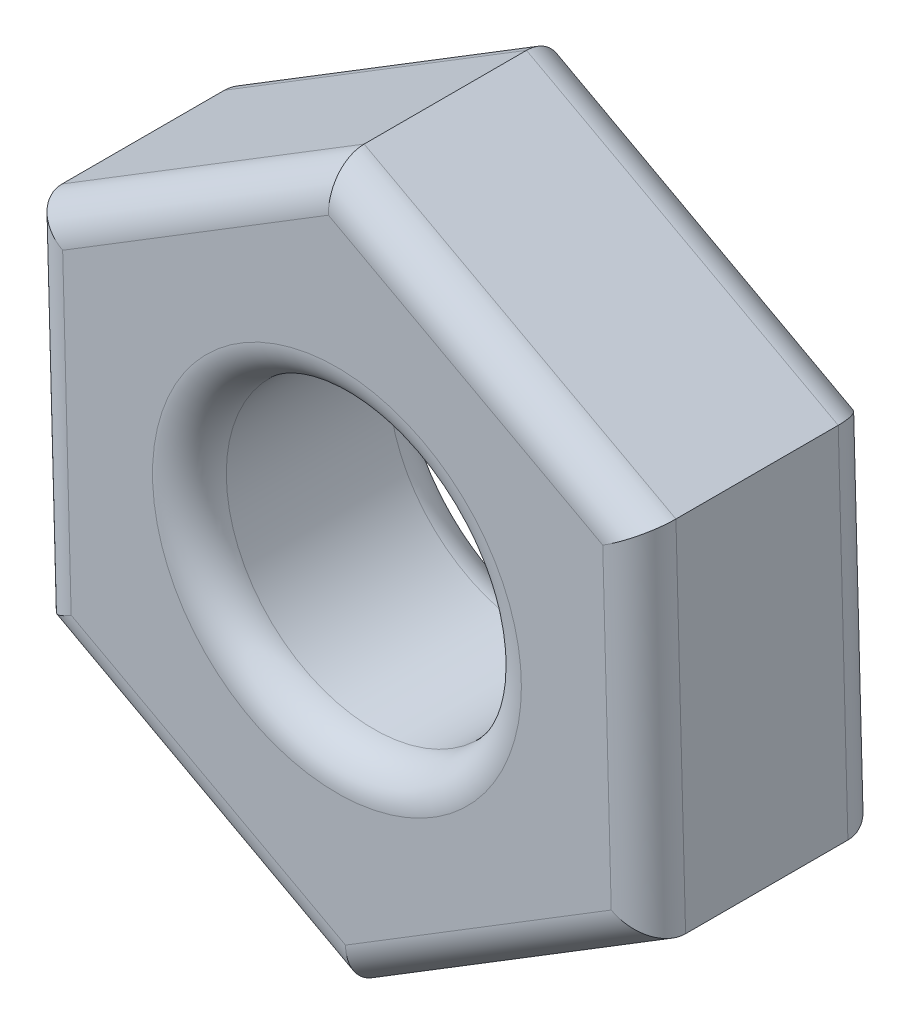
ISO-10303-21;
HEADER;
FILE_DESCRIPTION(('STEP AP214'),'2;1');
FILE_NAME('part.step','',(''),(''),'','','');
FILE_SCHEMA(('AUTOMOTIVE_DESIGN { 1 0 10303 214 1 1 1 1 }'));
ENDSEC;
DATA;
#1=APPLICATION_CONTEXT('core data for automotive mechanical design processes');
#2=APPLICATION_PROTOCOL_DEFINITION('international standard','automotive_design',2000,#1);
#3=PRODUCT_CONTEXT('',#1,'mechanical');
#4=PRODUCT('Part','Part','',(#3));
#5=PRODUCT_RELATED_PRODUCT_CATEGORY('part','',(#4));
#6=PRODUCT_DEFINITION_FORMATION('','',#4);
#7=PRODUCT_DEFINITION_CONTEXT('part definition',#1,'design');
#8=PRODUCT_DEFINITION('design','',#6,#7);
#9=PRODUCT_DEFINITION_SHAPE('','',#8);
#10=(LENGTH_UNIT() NAMED_UNIT(*) SI_UNIT(.MILLI.,.METRE.));
#11=(NAMED_UNIT(*) PLANE_ANGLE_UNIT() SI_UNIT($,.RADIAN.));
#12=(NAMED_UNIT(*) SI_UNIT($,.STERADIAN.) SOLID_ANGLE_UNIT());
#13=UNCERTAINTY_MEASURE_WITH_UNIT(LENGTH_MEASURE(1.E-05),#10,'distance_accuracy_value','');
#14=(GEOMETRIC_REPRESENTATION_CONTEXT(3) GLOBAL_UNCERTAINTY_ASSIGNED_CONTEXT((#13)) GLOBAL_UNIT_ASSIGNED_CONTEXT((#10,
#11,#12)) REPRESENTATION_CONTEXT('',''));
#15=CARTESIAN_POINT('',(0.,0.,0.));
#16=DIRECTION('',(0.,0.,1.));
#17=DIRECTION('',(1.,0.,0.));
#18=AXIS2_PLACEMENT_3D('',#15,#16,#17);
#19=CARTESIAN_POINT('',(0.,0.,1.6));
#20=DIRECTION('',(0.,0.,1.));
#21=DIRECTION('',(1.,0.,0.));
#22=AXIS2_PLACEMENT_3D('',#19,#20,#21);
#23=PLANE('',#22);
#24=CARTESIAN_POINT('',(0.,0.,1.6));
#25=DIRECTION('',(0.,0.,1.));
#26=DIRECTION('',(1.,0.,0.));
#27=AXIS2_PLACEMENT_3D('',#24,#25,#26);
#28=CIRCLE('',#27,1.25);
#29=CARTESIAN_POINT('',(1.25,0.,1.6));
#30=VERTEX_POINT('',#29);
#31=EDGE_CURVE('E11',#30,#30,#28,.F.);
#32=ORIENTED_EDGE('',*,*,#31,.T.);
#33=EDGE_LOOP('',(#32));
#34=FACE_BOUND('',#33,.T.);
#35=DIRECTION('',(-0.87934418772516,0.476186727570161,0.));
#36=VECTOR('',#35,1.);
#37=CARTESIAN_POINT('',(-0.184597063695502,2.18194107289755,1.6));
#38=LINE('',#37,#36);
#39=CARTESIAN_POINT('',(1.80125572633261,1.10655244268906,1.6));
#40=VERTEX_POINT('',#39);
#41=CARTESIAN_POINT('',(-0.0576746628221386,2.11320943906076,1.6));
#42=VERTEX_POINT('',#41);
#43=EDGE_CURVE('E57',#40,#42,#38,.T.);
#44=ORIENTED_EDGE('',*,*,#43,.T.);
#45=DIRECTION('',(-0.852061896883319,-0.5234410414551,0.));
#46=VECTOR('',#45,1.);
#47=CARTESIAN_POINT('',(-1.98191493053771,0.931104789824457,1.6));
#48=LINE('',#47,#46);
#49=CARTESIAN_POINT('',(-1.85893038915476,1.00665699637171,1.6));
#50=VERTEX_POINT('',#49);
#51=EDGE_CURVE('E48',#42,#50,#48,.T.);
#52=ORIENTED_EDGE('',*,*,#51,.T.);
#53=DIRECTION('',(0.0272822908418408,-0.999627769025261,0.));
#54=VECTOR('',#53,1.);
#55=CARTESIAN_POINT('',(-1.7973178668422,-1.2508362830731,1.6));
#56=LINE('',#55,#54);
#57=CARTESIAN_POINT('',(-1.80125572633262,-1.10655244268906,1.6));
#58=VERTEX_POINT('',#57);
#59=EDGE_CURVE('E193',#50,#58,#56,.T.);
#60=ORIENTED_EDGE('',*,*,#59,.T.);
#61=DIRECTION('',(0.87934418772516,-0.476186727570161,0.));
#62=VECTOR('',#61,1.);
#63=CARTESIAN_POINT('',(0.184597063695502,-2.18194107289755,1.6));
#64=LINE('',#63,#62);
#65=CARTESIAN_POINT('',(0.057674662822138,-2.11320943906076,1.6));
#66=VERTEX_POINT('',#65);
#67=EDGE_CURVE('E200',#58,#66,#64,.T.);
#68=ORIENTED_EDGE('',*,*,#67,.T.);
#69=DIRECTION('',(0.852061896883319,0.523441041455101,0.));
#70=VECTOR('',#69,1.);
#71=CARTESIAN_POINT('',(1.98191493053771,-0.931104789824457,1.6));
#72=LINE('',#71,#70);
#73=CARTESIAN_POINT('',(1.85893038915475,-1.00665699637171,1.6));
#74=VERTEX_POINT('',#73);
#75=EDGE_CURVE('E199',#66,#74,#72,.T.);
#76=ORIENTED_EDGE('',*,*,#75,.T.);
#77=DIRECTION('',(-0.0272822908418408,0.999627769025262,0.));
#78=VECTOR('',#77,1.);
#79=CARTESIAN_POINT('',(1.7973178668422,1.2508362830731,1.6));
#80=LINE('',#79,#78);
#81=EDGE_CURVE('E62',#74,#40,#80,.T.);
#82=ORIENTED_EDGE('',*,*,#81,.T.);
#83=EDGE_LOOP('',(#44,#52,#60,#68,#76,#82));
#84=FACE_BOUND('',#83,.T.);
#85=ADVANCED_FACE('F39',(#34,#84),#23,.T.);
#86=CARTESIAN_POINT('',(0.,0.,0.));
#87=DIRECTION('',(0.,0.,1.));
#88=DIRECTION('',(1.,0.,0.));
#89=AXIS2_PLACEMENT_3D('',#86,#87,#88);
#90=PLANE('',#89);
#91=CARTESIAN_POINT('',(0.,0.,0.));
#92=DIRECTION('',(0.,0.,1.));
#93=DIRECTION('',(1.,0.,0.));
#94=AXIS2_PLACEMENT_3D('',#91,#92,#93);
#95=CIRCLE('',#94,1.25);
#96=CARTESIAN_POINT('',(1.25,0.,0.));
#97=VERTEX_POINT('',#96);
#98=EDGE_CURVE('E160',#97,#97,#95,.T.);
#99=ORIENTED_EDGE('',*,*,#98,.T.);
#100=EDGE_LOOP('',(#99));
#101=FACE_BOUND('',#100,.T.);
#102=DIRECTION('',(0.852061896883319,0.523441041455101,0.));
#103=VECTOR('',#102,1.);
#104=CARTESIAN_POINT('',(0.958302525988447,-1.55993321771624,0.));
#105=LINE('',#104,#103);
#106=CARTESIAN_POINT('',(1.85893038915475,-1.00665699637171,0.));
#107=VERTEX_POINT('',#106);
#108=CARTESIAN_POINT('',(0.0576746628221387,-2.11320943906076,0.));
#109=VERTEX_POINT('',#108);
#110=EDGE_CURVE('E157',#107,#109,#105,.F.);
#111=ORIENTED_EDGE('',*,*,#110,.T.);
#112=DIRECTION('',(0.87934418772516,-0.476186727570161,0.));
#113=VECTOR('',#112,1.);
#114=CARTESIAN_POINT('',(-0.871790531755239,-1.60988094087491,0.));
#115=LINE('',#114,#113);
#116=CARTESIAN_POINT('',(-1.80125572633262,-1.10655244268906,0.));
#117=VERTEX_POINT('',#116);
#118=EDGE_CURVE('E134',#109,#117,#115,.F.);
#119=ORIENTED_EDGE('',*,*,#118,.T.);
#120=DIRECTION('',(0.0272822908418408,-0.999627769025261,0.));
#121=VECTOR('',#120,1.);
#122=CARTESIAN_POINT('',(-1.83009305774369,-0.0499477231586743,0.));
#123=LINE('',#122,#121);
#124=CARTESIAN_POINT('',(-1.85893038915476,1.00665699637171,0.));
#125=VERTEX_POINT('',#124);
#126=EDGE_CURVE('E144',#117,#125,#123,.F.);
#127=ORIENTED_EDGE('',*,*,#126,.T.);
#128=DIRECTION('',(-0.852061896883319,-0.5234410414551,0.));
#129=VECTOR('',#128,1.);
#130=CARTESIAN_POINT('',(-0.958302525988447,1.55993321771624,0.));
#131=LINE('',#130,#129);
#132=CARTESIAN_POINT('',(-0.0576746628221387,2.11320943906076,0.));
#133=VERTEX_POINT('',#132);
#134=EDGE_CURVE('E152',#125,#133,#131,.F.);
#135=ORIENTED_EDGE('',*,*,#134,.T.);
#136=DIRECTION('',(-0.87934418772516,0.476186727570161,0.));
#137=VECTOR('',#136,1.);
#138=CARTESIAN_POINT('',(0.871790531755239,1.60988094087491,0.));
#139=LINE('',#138,#137);
#140=CARTESIAN_POINT('',(1.80125572633262,1.10655244268906,0.));
#141=VERTEX_POINT('',#140);
#142=EDGE_CURVE('E257',#133,#141,#139,.F.);
#143=ORIENTED_EDGE('',*,*,#142,.T.);
#144=DIRECTION('',(-0.0272822908418408,0.999627769025262,0.));
#145=VECTOR('',#144,1.);
#146=CARTESIAN_POINT('',(1.83009305774368,0.0499477231586742,0.));
#147=LINE('',#146,#145);
#148=EDGE_CURVE('E165',#141,#107,#147,.F.);
#149=ORIENTED_EDGE('',*,*,#148,.T.);
#150=EDGE_LOOP('',(#111,#119,#127,#135,#143,#149));
#151=FACE_BOUND('',#150,.T.);
#152=ADVANCED_FACE('F154',(#101,#151),#90,.F.);
#153=CARTESIAN_POINT('',(-2.11277519090148,1.14412026404529,1.6));
#154=DIRECTION('',(0.999627769025261,0.0272822908418408,0.));
#155=DIRECTION('',(-0.0272822908418408,0.999627769025261,0.));
#156=AXIS2_PLACEMENT_3D('',#153,#154,#155);
#157=PLANE('',#156);
#158=DIRECTION('',(0.,0.,-1.));
#159=VECTOR('',#158,1.);
#160=CARTESIAN_POINT('',(-2.11277519090148,1.14412026404529,1.6));
#161=LINE('',#160,#159);
#162=CARTESIAN_POINT('',(-2.11277519090148,1.14412026404529,1.35));
#163=VERTEX_POINT('',#162);
#164=CARTESIAN_POINT('',(-2.11277519090148,1.14412026404529,0.25));
#165=VERTEX_POINT('',#164);
#166=EDGE_CURVE('E215',#163,#165,#161,.T.);
#167=ORIENTED_EDGE('',*,*,#166,.T.);
#168=DIRECTION('',(0.0272822908418408,-0.999627769025261,0.));
#169=VECTOR('',#168,1.);
#170=CARTESIAN_POINT('',(-2.11277519090148,1.14412026404529,0.25));
#171=LINE('',#170,#169);
#172=CARTESIAN_POINT('',(-2.04722480909852,-1.25765685578356,0.25));
#173=VERTEX_POINT('',#172);
#174=EDGE_CURVE('E194',#165,#173,#171,.T.);
#175=ORIENTED_EDGE('',*,*,#174,.T.);
#176=DIRECTION('',(0.,0.,-1.));
#177=VECTOR('',#176,1.);
#178=CARTESIAN_POINT('',(-2.04722480909852,-1.25765685578356,1.6));
#179=LINE('',#178,#177);
#180=CARTESIAN_POINT('',(-2.04722480909852,-1.25765685578356,1.35));
#181=VERTEX_POINT('',#180);
#182=EDGE_CURVE('E155',#181,#173,#179,.T.);
#183=ORIENTED_EDGE('',*,*,#182,.F.);
#184=DIRECTION('',(0.0272822908418408,-0.999627769025261,0.));
#185=VECTOR('',#184,1.);
#186=CARTESIAN_POINT('',(-2.11277519090148,1.14412026404529,1.35));
#187=LINE('',#186,#185);
#188=EDGE_CURVE('E192',#181,#163,#187,.F.);
#189=ORIENTED_EDGE('',*,*,#188,.T.);
#190=EDGE_LOOP('',(#167,#175,#183,#189));
#191=FACE_BOUND('',#190,.T.);
#192=ADVANCED_FACE('F282',(#191),#157,.F.);
#193=CARTESIAN_POINT('',(-2.04722480909852,-1.25765685578356,1.6));
#194=DIRECTION('',(0.476186727570161,0.87934418772516,0.));
#195=DIRECTION('',(-0.87934418772516,0.476186727570161,0.));
#196=AXIS2_PLACEMENT_3D('',#193,#194,#195);
#197=PLANE('',#196);
#198=ORIENTED_EDGE('',*,*,#182,.T.);
#199=DIRECTION('',(0.87934418772516,-0.476186727570161,0.));
#200=VECTOR('',#199,1.);
#201=CARTESIAN_POINT('',(-2.04722480909852,-1.25765685578356,0.25));
#202=LINE('',#201,#200);
#203=CARTESIAN_POINT('',(0.0655503818029616,-2.40177711982884,0.25));
#204=VERTEX_POINT('',#203);
#205=EDGE_CURVE('E138',#173,#204,#202,.T.);
#206=ORIENTED_EDGE('',*,*,#205,.T.);
#207=DIRECTION('',(0.,0.,-1.));
#208=VECTOR('',#207,1.);
#209=CARTESIAN_POINT('',(0.0655503818029616,-2.40177711982884,1.6));
#210=LINE('',#209,#208);
#211=CARTESIAN_POINT('',(0.0655503818029616,-2.40177711982884,1.35));
#212=VERTEX_POINT('',#211);
#213=EDGE_CURVE('E243',#212,#204,#210,.T.);
#214=ORIENTED_EDGE('',*,*,#213,.F.);
#215=DIRECTION('',(0.87934418772516,-0.476186727570161,0.));
#216=VECTOR('',#215,1.);
#217=CARTESIAN_POINT('',(-2.04722480909852,-1.25765685578356,1.35));
#218=LINE('',#217,#216);
#219=EDGE_CURVE('E173',#212,#181,#218,.F.);
#220=ORIENTED_EDGE('',*,*,#219,.T.);
#221=EDGE_LOOP('',(#198,#206,#214,#220));
#222=FACE_BOUND('',#221,.T.);
#223=ADVANCED_FACE('F246',(#222),#197,.F.);
#224=CARTESIAN_POINT('',(0.0655503818029616,-2.40177711982884,1.6));
#225=DIRECTION('',(-0.5234410414551,0.852061896883319,0.));
#226=DIRECTION('',(-0.852061896883319,-0.523441041455101,0.));
#227=AXIS2_PLACEMENT_3D('',#224,#225,#226);
#228=PLANE('',#227);
#229=ORIENTED_EDGE('',*,*,#213,.T.);
#230=DIRECTION('',(0.852061896883319,0.523441041455101,0.));
#231=VECTOR('',#230,1.);
#232=CARTESIAN_POINT('',(0.0655503818029616,-2.40177711982884,0.25));
#233=LINE('',#232,#231);
#234=CARTESIAN_POINT('',(2.11277519090148,-1.14412026404529,0.25));
#235=VERTEX_POINT('',#234);
#236=EDGE_CURVE('E176',#204,#235,#233,.T.);
#237=ORIENTED_EDGE('',*,*,#236,.T.);
#238=DIRECTION('',(0.,0.,-1.));
#239=VECTOR('',#238,1.);
#240=CARTESIAN_POINT('',(2.11277519090148,-1.14412026404529,1.6));
#241=LINE('',#240,#239);
#242=CARTESIAN_POINT('',(2.11277519090148,-1.14412026404529,1.35));
#243=VERTEX_POINT('',#242);
#244=EDGE_CURVE('E241',#243,#235,#241,.T.);
#245=ORIENTED_EDGE('',*,*,#244,.F.);
#246=DIRECTION('',(0.852061896883319,0.523441041455101,0.));
#247=VECTOR('',#246,1.);
#248=CARTESIAN_POINT('',(0.0655503818029614,-2.40177711982884,1.35));
#249=LINE('',#248,#247);
#250=EDGE_CURVE('E174',#243,#212,#249,.F.);
#251=ORIENTED_EDGE('',*,*,#250,.T.);
#252=EDGE_LOOP('',(#229,#237,#245,#251));
#253=FACE_BOUND('',#252,.T.);
#254=ADVANCED_FACE('F245',(#253),#228,.F.);
#255=CARTESIAN_POINT('',(2.11277519090148,-1.14412026404529,1.6));
#256=DIRECTION('',(-0.999627769025261,-0.0272822908418408,0.));
#257=DIRECTION('',(0.0272822908418408,-0.999627769025262,0.));
#258=AXIS2_PLACEMENT_3D('',#255,#256,#257);
#259=PLANE('',#258);
#260=ORIENTED_EDGE('',*,*,#244,.T.);
#261=DIRECTION('',(-0.0272822908418408,0.999627769025262,0.));
#262=VECTOR('',#261,1.);
#263=CARTESIAN_POINT('',(2.11277519090148,-1.14412026404529,0.25));
#264=LINE('',#263,#262);
#265=CARTESIAN_POINT('',(2.04722480909852,1.25765685578356,0.25));
#266=VERTEX_POINT('',#265);
#267=EDGE_CURVE('E179',#235,#266,#264,.T.);
#268=ORIENTED_EDGE('',*,*,#267,.T.);
#269=DIRECTION('',(0.,0.,-1.));
#270=VECTOR('',#269,1.);
#271=CARTESIAN_POINT('',(2.04722480909852,1.25765685578356,1.6));
#272=LINE('',#271,#270);
#273=CARTESIAN_POINT('',(2.04722480909852,1.25765685578356,1.35));
#274=VERTEX_POINT('',#273);
#275=EDGE_CURVE('E255',#274,#266,#272,.T.);
#276=ORIENTED_EDGE('',*,*,#275,.F.);
#277=DIRECTION('',(-0.0272822908418408,0.999627769025262,0.));
#278=VECTOR('',#277,1.);
#279=CARTESIAN_POINT('',(2.11277519090148,-1.14412026404529,1.35));
#280=LINE('',#279,#278);
#281=EDGE_CURVE('E178',#274,#243,#280,.F.);
#282=ORIENTED_EDGE('',*,*,#281,.T.);
#283=EDGE_LOOP('',(#260,#268,#276,#282));
#284=FACE_BOUND('',#283,.T.);
#285=ADVANCED_FACE('F267',(#284),#259,.F.);
#286=CARTESIAN_POINT('',(2.04722480909852,1.25765685578356,1.6));
#287=DIRECTION('',(-0.476186727570161,-0.87934418772516,0.));
#288=DIRECTION('',(0.87934418772516,-0.476186727570161,0.));
#289=AXIS2_PLACEMENT_3D('',#286,#287,#288);
#290=PLANE('',#289);
#291=ORIENTED_EDGE('',*,*,#275,.T.);
#292=DIRECTION('',(-0.87934418772516,0.476186727570161,0.));
#293=VECTOR('',#292,1.);
#294=CARTESIAN_POINT('',(2.04722480909852,1.25765685578356,0.25));
#295=LINE('',#294,#293);
#296=CARTESIAN_POINT('',(-0.0655503818029618,2.40177711982884,0.25));
#297=VERTEX_POINT('',#296);
#298=EDGE_CURVE('E182',#266,#297,#295,.T.);
#299=ORIENTED_EDGE('',*,*,#298,.T.);
#300=DIRECTION('',(0.,0.,-1.));
#301=VECTOR('',#300,1.);
#302=CARTESIAN_POINT('',(-0.0655503818029618,2.40177711982884,1.6));
#303=LINE('',#302,#301);
#304=CARTESIAN_POINT('',(-0.0655503818029618,2.40177711982884,1.35));
#305=VERTEX_POINT('',#304);
#306=EDGE_CURVE('E272',#305,#297,#303,.T.);
#307=ORIENTED_EDGE('',*,*,#306,.F.);
#308=DIRECTION('',(-0.87934418772516,0.476186727570161,0.));
#309=VECTOR('',#308,1.);
#310=CARTESIAN_POINT('',(2.04722480909852,1.25765685578356,1.35));
#311=LINE('',#310,#309);
#312=EDGE_CURVE('E185',#305,#274,#311,.F.);
#313=ORIENTED_EDGE('',*,*,#312,.T.);
#314=EDGE_LOOP('',(#291,#299,#307,#313));
#315=FACE_BOUND('',#314,.T.);
#316=ADVANCED_FACE('F295',(#315),#290,.F.);
#317=CARTESIAN_POINT('',(-0.0655503818029618,2.40177711982884,1.6));
#318=DIRECTION('',(0.5234410414551,-0.852061896883319,0.));
#319=DIRECTION('',(0.852061896883319,0.5234410414551,0.));
#320=AXIS2_PLACEMENT_3D('',#317,#318,#319);
#321=PLANE('',#320);
#322=ORIENTED_EDGE('',*,*,#306,.T.);
#323=DIRECTION('',(-0.852061896883319,-0.5234410414551,0.));
#324=VECTOR('',#323,1.);
#325=CARTESIAN_POINT('',(-0.0655503818029618,2.40177711982884,0.25));
#326=LINE('',#325,#324);
#327=EDGE_CURVE('E188',#297,#165,#326,.T.);
#328=ORIENTED_EDGE('',*,*,#327,.T.);
#329=ORIENTED_EDGE('',*,*,#166,.F.);
#330=DIRECTION('',(-0.852061896883319,-0.5234410414551,0.));
#331=VECTOR('',#330,1.);
#332=CARTESIAN_POINT('',(-0.0655503818029619,2.40177711982884,1.35));
#333=LINE('',#332,#331);
#334=EDGE_CURVE('E186',#163,#305,#333,.F.);
#335=ORIENTED_EDGE('',*,*,#334,.T.);
#336=EDGE_LOOP('',(#322,#328,#329,#335));
#337=FACE_BOUND('',#336,.T.);
#338=ADVANCED_FACE('F291',(#337),#321,.F.);
#339=CARTESIAN_POINT('',(0.,0.,1.6));
#340=DIRECTION('',(0.,0.,-1.));
#341=DIRECTION('',(-1.,0.,0.));
#342=AXIS2_PLACEMENT_3D('',#339,#340,#341);
#343=CYLINDRICAL_SURFACE('',#342,1.);
#344=CARTESIAN_POINT('',(0.,0.,0.25));
#345=DIRECTION('',(0.,0.,1.));
#346=DIRECTION('',(1.,0.,0.));
#347=AXIS2_PLACEMENT_3D('',#344,#345,#346);
#348=CIRCLE('',#347,1.);
#349=CARTESIAN_POINT('',(1.,0.,0.25));
#350=VERTEX_POINT('',#349);
#351=EDGE_CURVE('E166',#350,#350,#348,.F.);
#352=ORIENTED_EDGE('',*,*,#351,.T.);
#353=EDGE_LOOP('',(#352));
#354=FACE_BOUND('',#353,.T.);
#355=CARTESIAN_POINT('',(0.,0.,1.35));
#356=DIRECTION('',(0.,0.,1.));
#357=DIRECTION('',(1.,0.,0.));
#358=AXIS2_PLACEMENT_3D('',#355,#356,#357);
#359=CIRCLE('',#358,1.);
#360=CARTESIAN_POINT('',(1.,0.,1.35));
#361=VERTEX_POINT('',#360);
#362=EDGE_CURVE('E158',#361,#361,#359,.T.);
#363=ORIENTED_EDGE('',*,*,#362,.T.);
#364=EDGE_LOOP('',(#363));
#365=FACE_BOUND('',#364,.T.);
#366=ADVANCED_FACE('F315',(#354,#365),#343,.F.);
#367=CARTESIAN_POINT('',(0.,0.,0.25));
#368=DIRECTION('',(0.,0.,1.));
#369=DIRECTION('',(1.,0.,0.));
#370=AXIS2_PLACEMENT_3D('',#367,#368,#369);
#371=TOROIDAL_SURFACE('',#370,1.25,0.25);
#372=ORIENTED_EDGE('',*,*,#351,.F.);
#373=EDGE_LOOP('',(#372));
#374=FACE_BOUND('',#373,.T.);
#375=ORIENTED_EDGE('',*,*,#98,.F.);
#376=EDGE_LOOP('',(#375));
#377=FACE_BOUND('',#376,.T.);
#378=ADVANCED_FACE('F327',(#374,#377),#371,.T.);
#379=CARTESIAN_POINT('',(1.92817812720598,1.03782080885227,0.25));
#380=DIRECTION('',(-0.87934418772516,0.476186727570161,0.));
#381=DIRECTION('',(-0.476186727570161,-0.87934418772516,0.));
#382=AXIS2_PLACEMENT_3D('',#379,#380,#381);
#383=CYLINDRICAL_SURFACE('',#382,0.25);
#384=CARTESIAN_POINT('',(1.80125572633261,1.10655244268906,0.25));
#385=DIRECTION('',(-0.5234410414551,0.852061896883319,0.));
#386=DIRECTION('',(-0.852061896883319,-0.523441041455101,0.));
#387=AXIS2_PLACEMENT_3D('',#384,#385,#386);
#388=ELLIPSE('',#387,0.288675134594813,0.25);
#389=EDGE_CURVE('E208',#141,#266,#388,.F.);
#390=ORIENTED_EDGE('',*,*,#389,.F.);
#391=ORIENTED_EDGE('',*,*,#142,.F.);
#392=CARTESIAN_POINT('',(-0.0576746628221385,2.11320943906076,0.25));
#393=DIRECTION('',(-0.999627769025261,-0.0272822908418408,0.));
#394=DIRECTION('',(0.0272822908418409,-0.999627769025261,0.));
#395=AXIS2_PLACEMENT_3D('',#392,#393,#394);
#396=ELLIPSE('',#395,0.288675134594813,0.25);
#397=EDGE_CURVE('E213',#297,#133,#396,.T.);
#398=ORIENTED_EDGE('',*,*,#397,.F.);
#399=ORIENTED_EDGE('',*,*,#298,.F.);
#400=EDGE_LOOP('',(#390,#391,#398,#399));
#401=FACE_BOUND('',#400,.T.);
#402=ADVANCED_FACE('F286',(#401),#383,.T.);
#403=CARTESIAN_POINT('',(0.0653098785608133,2.18876164560801,0.25));
#404=DIRECTION('',(-0.852061896883319,-0.5234410414551,0.));
#405=DIRECTION('',(0.5234410414551,-0.852061896883319,0.));
#406=AXIS2_PLACEMENT_3D('',#403,#404,#405);
#407=CYLINDRICAL_SURFACE('',#406,0.25);
#408=ORIENTED_EDGE('',*,*,#397,.T.);
#409=ORIENTED_EDGE('',*,*,#134,.F.);
#410=CARTESIAN_POINT('',(-1.85893038915475,1.00665699637171,0.25));
#411=DIRECTION('',(-0.476186727570161,-0.87934418772516,0.));
#412=DIRECTION('',(0.87934418772516,-0.476186727570161,0.));
#413=AXIS2_PLACEMENT_3D('',#410,#411,#412);
#414=ELLIPSE('',#413,0.288675134594813,0.25);
#415=EDGE_CURVE('E149',#165,#125,#414,.T.);
#416=ORIENTED_EDGE('',*,*,#415,.F.);
#417=ORIENTED_EDGE('',*,*,#327,.F.);
#418=EDGE_LOOP('',(#408,#409,#416,#417));
#419=FACE_BOUND('',#418,.T.);
#420=ADVANCED_FACE('F290',(#419),#407,.T.);
#421=CARTESIAN_POINT('',(1.86286824864517,-1.15094083675575,0.25));
#422=DIRECTION('',(-0.0272822908418408,0.999627769025262,0.));
#423=DIRECTION('',(-0.999627769025261,-0.0272822908418408,0.));
#424=AXIS2_PLACEMENT_3D('',#421,#422,#423);
#425=CYLINDRICAL_SURFACE('',#424,0.25);
#426=ORIENTED_EDGE('',*,*,#389,.T.);
#427=ORIENTED_EDGE('',*,*,#267,.F.);
#428=CARTESIAN_POINT('',(1.85893038915475,-1.00665699637171,0.25));
#429=DIRECTION('',(0.476186727570161,0.87934418772516,0.));
#430=DIRECTION('',(-0.87934418772516,0.476186727570161,0.));
#431=AXIS2_PLACEMENT_3D('',#428,#429,#430);
#432=ELLIPSE('',#431,0.288675134594813,0.25);
#433=EDGE_CURVE('E141',#107,#235,#432,.F.);
#434=ORIENTED_EDGE('',*,*,#433,.F.);
#435=ORIENTED_EDGE('',*,*,#148,.F.);
#436=EDGE_LOOP('',(#426,#427,#434,#435));
#437=FACE_BOUND('',#436,.T.);
#438=ADVANCED_FACE('F264',(#437),#425,.T.);
#439=CARTESIAN_POINT('',(-1.86286824864517,1.15094083675575,0.25));
#440=DIRECTION('',(0.0272822908418408,-0.999627769025261,0.));
#441=DIRECTION('',(0.999627769025261,0.0272822908418408,0.));
#442=AXIS2_PLACEMENT_3D('',#439,#440,#441);
#443=CYLINDRICAL_SURFACE('',#442,0.25);
#444=ORIENTED_EDGE('',*,*,#415,.T.);
#445=ORIENTED_EDGE('',*,*,#126,.F.);
#446=CARTESIAN_POINT('',(-1.80125572633262,-1.10655244268906,0.25));
#447=DIRECTION('',(0.5234410414551,-0.852061896883319,0.));
#448=DIRECTION('',(-0.852061896883319,-0.5234410414551,0.));
#449=AXIS2_PLACEMENT_3D('',#446,#447,#448);
#450=ELLIPSE('',#449,0.288675134594813,0.25);
#451=EDGE_CURVE('E131',#173,#117,#450,.T.);
#452=ORIENTED_EDGE('',*,*,#451,.F.);
#453=ORIENTED_EDGE('',*,*,#174,.F.);
#454=EDGE_LOOP('',(#444,#445,#452,#453));
#455=FACE_BOUND('',#454,.T.);
#456=ADVANCED_FACE('F147',(#455),#443,.T.);
#457=CARTESIAN_POINT('',(-0.0653098785608135,-2.18876164560801,0.25));
#458=DIRECTION('',(0.852061896883319,0.523441041455101,0.));
#459=DIRECTION('',(-0.523441041455101,0.852061896883319,0.));
#460=AXIS2_PLACEMENT_3D('',#457,#458,#459);
#461=CYLINDRICAL_SURFACE('',#460,0.25);
#462=ORIENTED_EDGE('',*,*,#433,.T.);
#463=ORIENTED_EDGE('',*,*,#236,.F.);
#464=CARTESIAN_POINT('',(0.0576746628221392,-2.11320943906076,0.25));
#465=DIRECTION('',(0.999627769025261,0.0272822908418408,0.));
#466=DIRECTION('',(-0.0272822908418409,0.999627769025261,0.));
#467=AXIS2_PLACEMENT_3D('',#464,#465,#466);
#468=ELLIPSE('',#467,0.288675134594813,0.25);
#469=EDGE_CURVE('E145',#109,#204,#468,.F.);
#470=ORIENTED_EDGE('',*,*,#469,.F.);
#471=ORIENTED_EDGE('',*,*,#110,.F.);
#472=EDGE_LOOP('',(#462,#463,#470,#471));
#473=FACE_BOUND('',#472,.T.);
#474=ADVANCED_FACE('F270',(#473),#461,.T.);
#475=CARTESIAN_POINT('',(-1.92817812720598,-1.03782080885227,0.25));
#476=DIRECTION('',(0.87934418772516,-0.476186727570161,0.));
#477=DIRECTION('',(0.476186727570161,0.87934418772516,0.));
#478=AXIS2_PLACEMENT_3D('',#475,#476,#477);
#479=CYLINDRICAL_SURFACE('',#478,0.25);
#480=ORIENTED_EDGE('',*,*,#451,.T.);
#481=ORIENTED_EDGE('',*,*,#118,.F.);
#482=ORIENTED_EDGE('',*,*,#469,.T.);
#483=ORIENTED_EDGE('',*,*,#205,.F.);
#484=EDGE_LOOP('',(#480,#481,#482,#483));
#485=FACE_BOUND('',#484,.T.);
#486=ADVANCED_FACE('F133',(#485),#479,.T.);
#487=CARTESIAN_POINT('',(0.,0.,1.35));
#488=DIRECTION('',(0.,0.,1.));
#489=DIRECTION('',(1.,0.,0.));
#490=AXIS2_PLACEMENT_3D('',#487,#488,#489);
#491=TOROIDAL_SURFACE('',#490,1.25,0.25);
#492=ORIENTED_EDGE('',*,*,#31,.F.);
#493=EDGE_LOOP('',(#492));
#494=FACE_BOUND('',#493,.T.);
#495=ORIENTED_EDGE('',*,*,#362,.F.);
#496=EDGE_LOOP('',(#495));
#497=FACE_BOUND('',#496,.T.);
#498=ADVANCED_FACE('F335',(#494,#497),#491,.T.);
#499=CARTESIAN_POINT('',(0.958302525988447,-1.55993321771624,1.35));
#500=DIRECTION('',(-0.852061896883319,-0.523441041455101,0.));
#501=DIRECTION('',(0.523441041455101,-0.852061896883319,0.));
#502=AXIS2_PLACEMENT_3D('',#499,#500,#501);
#503=CYLINDRICAL_SURFACE('',#502,0.25);
#504=CARTESIAN_POINT('',(0.0576746628221379,-2.11320943906076,1.35));
#505=DIRECTION('',(-0.999627769025261,-0.0272822908418408,0.));
#506=DIRECTION('',(-0.0272822908418409,0.999627769025261,0.));
#507=AXIS2_PLACEMENT_3D('',#504,#505,#506);
#508=ELLIPSE('',#507,0.288675134594813,0.25);
#509=EDGE_CURVE('E222',#212,#66,#508,.T.);
#510=ORIENTED_EDGE('',*,*,#509,.F.);
#511=ORIENTED_EDGE('',*,*,#250,.F.);
#512=CARTESIAN_POINT('',(1.85893038915475,-1.00665699637171,1.35));
#513=DIRECTION('',(-0.476186727570161,-0.87934418772516,0.));
#514=DIRECTION('',(-0.87934418772516,0.476186727570161,0.));
#515=AXIS2_PLACEMENT_3D('',#512,#513,#514);
#516=ELLIPSE('',#515,0.288675134594813,0.25);
#517=EDGE_CURVE('E43',#74,#243,#516,.F.);
#518=ORIENTED_EDGE('',*,*,#517,.F.);
#519=ORIENTED_EDGE('',*,*,#75,.F.);
#520=EDGE_LOOP('',(#510,#511,#518,#519));
#521=FACE_BOUND('',#520,.T.);
#522=ADVANCED_FACE('F41',(#521),#503,.T.);
#523=CARTESIAN_POINT('',(1.83009305774368,0.0499477231586742,1.35));
#524=DIRECTION('',(0.0272822908418408,-0.999627769025262,0.));
#525=DIRECTION('',(0.999627769025261,0.0272822908418408,0.));
#526=AXIS2_PLACEMENT_3D('',#523,#524,#525);
#527=CYLINDRICAL_SURFACE('',#526,0.25);
#528=ORIENTED_EDGE('',*,*,#517,.T.);
#529=ORIENTED_EDGE('',*,*,#281,.F.);
#530=CARTESIAN_POINT('',(1.80125572633261,1.10655244268906,1.35));
#531=DIRECTION('',(0.5234410414551,-0.852061896883319,0.));
#532=DIRECTION('',(-0.852061896883319,-0.523441041455101,0.));
#533=AXIS2_PLACEMENT_3D('',#530,#531,#532);
#534=ELLIPSE('',#533,0.288675134594813,0.25);
#535=EDGE_CURVE('E225',#40,#274,#534,.F.);
#536=ORIENTED_EDGE('',*,*,#535,.F.);
#537=ORIENTED_EDGE('',*,*,#81,.F.);
#538=EDGE_LOOP('',(#528,#529,#536,#537));
#539=FACE_BOUND('',#538,.T.);
#540=ADVANCED_FACE('F233',(#539),#527,.T.);
#541=CARTESIAN_POINT('',(-0.871790531755239,-1.60988094087491,1.35));
#542=DIRECTION('',(-0.87934418772516,0.476186727570161,0.));
#543=DIRECTION('',(-0.476186727570161,-0.87934418772516,0.));
#544=AXIS2_PLACEMENT_3D('',#541,#542,#543);
#545=CYLINDRICAL_SURFACE('',#544,0.25);
#546=ORIENTED_EDGE('',*,*,#509,.T.);
#547=ORIENTED_EDGE('',*,*,#67,.F.);
#548=CARTESIAN_POINT('',(-1.80125572633262,-1.10655244268906,1.35));
#549=DIRECTION('',(-0.5234410414551,0.852061896883319,0.));
#550=DIRECTION('',(0.852061896883319,0.5234410414551,0.));
#551=AXIS2_PLACEMENT_3D('',#548,#549,#550);
#552=ELLIPSE('',#551,0.288675134594813,0.25);
#553=EDGE_CURVE('E219',#181,#58,#552,.T.);
#554=ORIENTED_EDGE('',*,*,#553,.F.);
#555=ORIENTED_EDGE('',*,*,#219,.F.);
#556=EDGE_LOOP('',(#546,#547,#554,#555));
#557=FACE_BOUND('',#556,.T.);
#558=ADVANCED_FACE('F351',(#557),#545,.T.);
#559=CARTESIAN_POINT('',(0.871790531755239,1.60988094087491,1.35));
#560=DIRECTION('',(0.87934418772516,-0.476186727570161,0.));
#561=DIRECTION('',(0.476186727570161,0.87934418772516,0.));
#562=AXIS2_PLACEMENT_3D('',#559,#560,#561);
#563=CYLINDRICAL_SURFACE('',#562,0.25);
#564=ORIENTED_EDGE('',*,*,#535,.T.);
#565=ORIENTED_EDGE('',*,*,#312,.F.);
#566=CARTESIAN_POINT('',(-0.0576746628221388,2.11320943906076,1.35));
#567=DIRECTION('',(0.999627769025261,0.0272822908418408,0.));
#568=DIRECTION('',(0.0272822908418409,-0.999627769025261,0.));
#569=AXIS2_PLACEMENT_3D('',#566,#567,#568);
#570=ELLIPSE('',#569,0.288675134594813,0.25);
#571=EDGE_CURVE('E220',#42,#305,#570,.F.);
#572=ORIENTED_EDGE('',*,*,#571,.F.);
#573=ORIENTED_EDGE('',*,*,#43,.F.);
#574=EDGE_LOOP('',(#564,#565,#572,#573));
#575=FACE_BOUND('',#574,.T.);
#576=ADVANCED_FACE('F349',(#575),#563,.T.);
#577=CARTESIAN_POINT('',(-1.83009305774369,-0.0499477231586743,1.35));
#578=DIRECTION('',(-0.0272822908418408,0.999627769025261,0.));
#579=DIRECTION('',(-0.999627769025261,-0.0272822908418408,0.));
#580=AXIS2_PLACEMENT_3D('',#577,#578,#579);
#581=CYLINDRICAL_SURFACE('',#580,0.25);
#582=ORIENTED_EDGE('',*,*,#553,.T.);
#583=ORIENTED_EDGE('',*,*,#59,.F.);
#584=CARTESIAN_POINT('',(-1.85893038915475,1.00665699637171,1.35));
#585=DIRECTION('',(0.476186727570161,0.87934418772516,0.));
#586=DIRECTION('',(-0.87934418772516,0.476186727570161,0.));
#587=AXIS2_PLACEMENT_3D('',#584,#585,#586);
#588=ELLIPSE('',#587,0.288675134594813,0.25);
#589=EDGE_CURVE('E214',#163,#50,#588,.T.);
#590=ORIENTED_EDGE('',*,*,#589,.F.);
#591=ORIENTED_EDGE('',*,*,#188,.F.);
#592=EDGE_LOOP('',(#582,#583,#590,#591));
#593=FACE_BOUND('',#592,.T.);
#594=ADVANCED_FACE('F303',(#593),#581,.T.);
#595=CARTESIAN_POINT('',(-0.958302525988447,1.55993321771624,1.35));
#596=DIRECTION('',(0.852061896883319,0.5234410414551,0.));
#597=DIRECTION('',(-0.5234410414551,0.852061896883319,0.));
#598=AXIS2_PLACEMENT_3D('',#595,#596,#597);
#599=CYLINDRICAL_SURFACE('',#598,0.25);
#600=ORIENTED_EDGE('',*,*,#571,.T.);
#601=ORIENTED_EDGE('',*,*,#334,.F.);
#602=ORIENTED_EDGE('',*,*,#589,.T.);
#603=ORIENTED_EDGE('',*,*,#51,.F.);
#604=EDGE_LOOP('',(#600,#601,#602,#603));
#605=FACE_BOUND('',#604,.T.);
#606=ADVANCED_FACE('F297',(#605),#599,.T.);
#607=CLOSED_SHELL('',(#85,#152,#192,#223,#254,#285,#316,#338,#366,#378,#402,#420,#438,#456,#474,
#486,#498,#522,#540,#558,#576,#594,#606));
#608=MANIFOLD_SOLID_BREP('B2',#607);
#609=ADVANCED_BREP_SHAPE_REPRESENTATION('',(#18,#608),#14);
#610=SHAPE_DEFINITION_REPRESENTATION(#9,#609);
ENDSEC;
END-ISO-10303-21;
